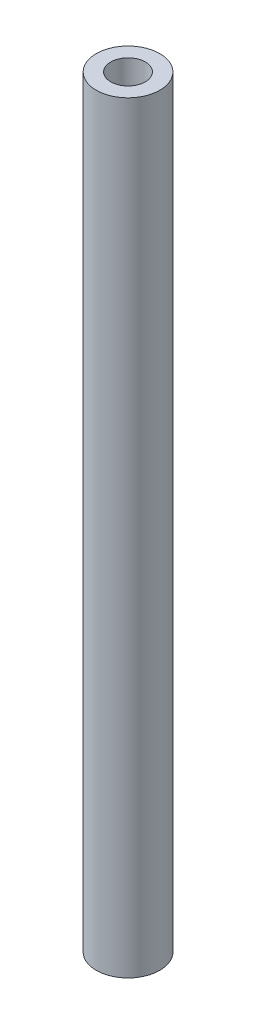
ISO-10303-21;
HEADER;
FILE_DESCRIPTION(('STEP AP214'),'2;1');
FILE_NAME('part.step','',(''),(''),'','','');
FILE_SCHEMA(('AUTOMOTIVE_DESIGN { 1 0 10303 214 1 1 1 1 }'));
ENDSEC;
DATA;
#1=APPLICATION_CONTEXT('core data for automotive mechanical design processes');
#2=APPLICATION_PROTOCOL_DEFINITION('international standard','automotive_design',2000,#1);
#3=PRODUCT_CONTEXT('',#1,'mechanical');
#4=PRODUCT('Part','Part','',(#3));
#5=PRODUCT_RELATED_PRODUCT_CATEGORY('part','',(#4));
#6=PRODUCT_DEFINITION_FORMATION('','',#4);
#7=PRODUCT_DEFINITION_CONTEXT('part definition',#1,'design');
#8=PRODUCT_DEFINITION('design','',#6,#7);
#9=PRODUCT_DEFINITION_SHAPE('','',#8);
#10=(LENGTH_UNIT() NAMED_UNIT(*) SI_UNIT(.MILLI.,.METRE.));
#11=(NAMED_UNIT(*) PLANE_ANGLE_UNIT() SI_UNIT($,.RADIAN.));
#12=(NAMED_UNIT(*) SI_UNIT($,.STERADIAN.) SOLID_ANGLE_UNIT());
#13=UNCERTAINTY_MEASURE_WITH_UNIT(LENGTH_MEASURE(1.E-05),#10,'distance_accuracy_value','');
#14=(GEOMETRIC_REPRESENTATION_CONTEXT(3) GLOBAL_UNCERTAINTY_ASSIGNED_CONTEXT((#13)) GLOBAL_UNIT_ASSIGNED_CONTEXT((#10,
#11,#12)) REPRESENTATION_CONTEXT('',''));
#15=CARTESIAN_POINT('',(0.,0.,0.));
#16=DIRECTION('',(0.,0.,1.));
#17=DIRECTION('',(1.,0.,0.));
#18=AXIS2_PLACEMENT_3D('',#15,#16,#17);
#19=CARTESIAN_POINT('',(0.,76.2,0.));
#20=DIRECTION('',(0.,-1.,0.));
#21=DIRECTION('',(0.,0.,-1.));
#22=AXIS2_PLACEMENT_3D('',#19,#20,#21);
#23=CYLINDRICAL_SURFACE('',#22,3.175);
#24=CARTESIAN_POINT('',(0.,76.2,0.));
#25=DIRECTION('',(0.,1.,0.));
#26=DIRECTION('',(0.,0.,1.));
#27=AXIS2_PLACEMENT_3D('',#24,#25,#26);
#28=CIRCLE('',#27,3.175);
#29=CARTESIAN_POINT('',(0.,76.2,-3.175));
#30=VERTEX_POINT('',#29);
#31=EDGE_CURVE('E11',#30,#30,#28,.T.);
#32=CARTESIAN_POINT('',(0.,0.,0.));
#33=DIRECTION('',(0.,1.,0.));
#34=DIRECTION('',(0.,0.,1.));
#35=AXIS2_PLACEMENT_3D('',#32,#33,#34);
#36=CIRCLE('',#35,3.175);
#37=CARTESIAN_POINT('',(0.,0.,-3.175));
#38=VERTEX_POINT('',#37);
#39=EDGE_CURVE('E39',#38,#38,#36,.T.);
#40=CARTESIAN_POINT('',(0.,76.2,-3.175));
#41=CARTESIAN_POINT('',(0.,75.40625,-3.175));
#42=CARTESIAN_POINT('',(0.,74.6125,-3.175));
#43=CARTESIAN_POINT('',(0.,73.025,-3.175));
#44=CARTESIAN_POINT('',(0.,72.23125,-3.175));
#45=CARTESIAN_POINT('',(0.,70.64375,-3.175));
#46=CARTESIAN_POINT('',(0.,69.85,-3.175));
#47=CARTESIAN_POINT('',(0.,68.2625,-3.175));
#48=CARTESIAN_POINT('',(0.,67.46875,-3.175));
#49=CARTESIAN_POINT('',(0.,65.88125,-3.175));
#50=CARTESIAN_POINT('',(0.,65.0875,-3.175));
#51=CARTESIAN_POINT('',(0.,63.5,-3.175));
#52=CARTESIAN_POINT('',(0.,62.70625,-3.175));
#53=CARTESIAN_POINT('',(0.,61.11875,-3.175));
#54=CARTESIAN_POINT('',(0.,60.325,-3.175));
#55=CARTESIAN_POINT('',(0.,58.7375,-3.175));
#56=CARTESIAN_POINT('',(0.,57.94375,-3.175));
#57=CARTESIAN_POINT('',(0.,56.35625,-3.175));
#58=CARTESIAN_POINT('',(0.,55.5625,-3.175));
#59=CARTESIAN_POINT('',(0.,53.975,-3.175));
#60=CARTESIAN_POINT('',(0.,53.18125,-3.175));
#61=CARTESIAN_POINT('',(0.,51.59375,-3.175));
#62=CARTESIAN_POINT('',(0.,50.8,-3.175));
#63=CARTESIAN_POINT('',(0.,49.2125,-3.175));
#64=CARTESIAN_POINT('',(0.,48.41875,-3.175));
#65=CARTESIAN_POINT('',(0.,46.83125,-3.175));
#66=CARTESIAN_POINT('',(0.,46.0375,-3.175));
#67=CARTESIAN_POINT('',(0.,44.45,-3.175));
#68=CARTESIAN_POINT('',(0.,43.65625,-3.175));
#69=CARTESIAN_POINT('',(0.,42.06875,-3.175));
#70=CARTESIAN_POINT('',(0.,41.275,-3.175));
#71=CARTESIAN_POINT('',(0.,39.6875,-3.175));
#72=CARTESIAN_POINT('',(0.,38.89375,-3.175));
#73=CARTESIAN_POINT('',(0.,37.30625,-3.175));
#74=CARTESIAN_POINT('',(0.,36.5125,-3.175));
#75=CARTESIAN_POINT('',(0.,34.925,-3.175));
#76=CARTESIAN_POINT('',(0.,34.13125,-3.175));
#77=CARTESIAN_POINT('',(0.,32.54375,-3.175));
#78=CARTESIAN_POINT('',(0.,31.75,-3.175));
#79=CARTESIAN_POINT('',(0.,30.1625,-3.175));
#80=CARTESIAN_POINT('',(0.,29.36875,-3.175));
#81=CARTESIAN_POINT('',(0.,27.78125,-3.175));
#82=CARTESIAN_POINT('',(0.,26.9875,-3.175));
#83=CARTESIAN_POINT('',(0.,25.4,-3.175));
#84=CARTESIAN_POINT('',(0.,24.60625,-3.175));
#85=CARTESIAN_POINT('',(0.,23.01875,-3.175));
#86=CARTESIAN_POINT('',(0.,22.225,-3.175));
#87=CARTESIAN_POINT('',(0.,20.6375,-3.175));
#88=CARTESIAN_POINT('',(0.,19.84375,-3.175));
#89=CARTESIAN_POINT('',(0.,18.25625,-3.175));
#90=CARTESIAN_POINT('',(0.,17.4625,-3.175));
#91=CARTESIAN_POINT('',(0.,15.875,-3.175));
#92=CARTESIAN_POINT('',(0.,15.08125,-3.175));
#93=CARTESIAN_POINT('',(0.,13.49375,-3.175));
#94=CARTESIAN_POINT('',(0.,12.7,-3.175));
#95=CARTESIAN_POINT('',(0.,11.1125,-3.175));
#96=CARTESIAN_POINT('',(0.,10.31875,-3.175));
#97=CARTESIAN_POINT('',(0.,8.73125,-3.175));
#98=CARTESIAN_POINT('',(0.,7.93750000000001,-3.175));
#99=CARTESIAN_POINT('',(0.,6.35,-3.175));
#100=CARTESIAN_POINT('',(0.,5.55625,-3.175));
#101=CARTESIAN_POINT('',(0.,3.96875,-3.175));
#102=CARTESIAN_POINT('',(0.,3.175,-3.175));
#103=CARTESIAN_POINT('',(0.,1.5875,-3.175));
#104=CARTESIAN_POINT('',(0.,0.793750000000001,-3.175));
#105=CARTESIAN_POINT('',(0.,0.,-3.175));
#106=B_SPLINE_CURVE_WITH_KNOTS('',3,(#40,#41,#42,#43,#44,#45,#46,#47,#48,#49,#50,#51,#52,#53,
#54,#55,#56,#57,#58,#59,#60,#61,#62,#63,#64,#65,#66,#67,#68,#69,#70,#71,#72,#73,#74,#75,#76,#77,
#78,#79,#80,#81,#82,#83,#84,#85,#86,#87,#88,#89,#90,#91,#92,#93,#94,#95,#96,#97,#98,#99,#100,
#101,#102,#103,#104,#105),.UNSPECIFIED.,.F.,.F.,(4,2,2,2,2,2,2,2,2,2,2,2,2,2,2,2,2,2,2,2,2,2,2,
2,2,2,2,2,2,2,2,2,4),(0.,2.38125,4.7625,7.14375,9.52500000000001,11.90625,14.2875,16.66875,
19.05,21.43125,23.8125,26.19375,28.575,30.95625,33.3375,35.71875,38.1,40.48125,42.8625,45.24375,
47.625,50.00625,52.3875,54.76875,57.15,59.53125,61.9125,64.29375,66.675,69.05625,71.4375,
73.81875,76.2),.UNSPECIFIED.);
#107=EDGE_CURVE('BSEAM36',#30,#38,#106,.T.);
#108=ORIENTED_EDGE('',*,*,#31,.F.);
#109=ORIENTED_EDGE('',*,*,#39,.T.);
#110=ORIENTED_EDGE('',*,*,#107,.T.);
#111=ORIENTED_EDGE('',*,*,#107,.F.);
#112=EDGE_LOOP('',(#108,#110,#109,#111));
#113=FACE_BOUND('',#112,.T.);
#114=ADVANCED_FACE('F36',(#113),#23,.T.);
#115=CARTESIAN_POINT('',(0.,76.2,0.));
#116=DIRECTION('',(0.,1.,0.));
#117=DIRECTION('',(0.,0.,1.));
#118=AXIS2_PLACEMENT_3D('',#115,#116,#117);
#119=PLANE('',#118);
#120=CARTESIAN_POINT('',(0.,76.2,0.));
#121=DIRECTION('',(0.,1.,0.));
#122=DIRECTION('',(0.,0.,1.));
#123=AXIS2_PLACEMENT_3D('',#120,#121,#122);
#124=CIRCLE('',#123,1.72719999999999);
#125=CARTESIAN_POINT('',(0.,76.2,1.72719999999999));
#126=VERTEX_POINT('',#125);
#127=EDGE_CURVE('E59',#126,#126,#124,.T.);
#128=ORIENTED_EDGE('',*,*,#127,.F.);
#129=EDGE_LOOP('',(#128));
#130=FACE_BOUND('',#129,.T.);
#131=ORIENTED_EDGE('',*,*,#31,.T.);
#132=EDGE_LOOP('',(#131));
#133=FACE_BOUND('',#132,.T.);
#134=ADVANCED_FACE('F78',(#130,#133),#119,.T.);
#135=CARTESIAN_POINT('',(0.,0.,0.));
#136=DIRECTION('',(0.,1.,0.));
#137=DIRECTION('',(0.,0.,1.));
#138=AXIS2_PLACEMENT_3D('',#135,#136,#137);
#139=PLANE('',#138);
#140=CARTESIAN_POINT('',(0.,0.,0.));
#141=DIRECTION('',(0.,-1.,0.));
#142=DIRECTION('',(0.,0.,-1.));
#143=AXIS2_PLACEMENT_3D('',#140,#141,#142);
#144=CIRCLE('',#143,1.72719999999999);
#145=CARTESIAN_POINT('',(0.,0.,-1.72719999999999));
#146=VERTEX_POINT('',#145);
#147=EDGE_CURVE('E60',#146,#146,#144,.T.);
#148=ORIENTED_EDGE('',*,*,#147,.F.);
#149=EDGE_LOOP('',(#148));
#150=FACE_BOUND('',#149,.T.);
#151=ORIENTED_EDGE('',*,*,#39,.F.);
#152=EDGE_LOOP('',(#151));
#153=FACE_BOUND('',#152,.T.);
#154=ADVANCED_FACE('F75',(#150,#153),#139,.F.);
#155=CARTESIAN_POINT('',(0.,66.2,0.));
#156=DIRECTION('',(0.,1.,0.));
#157=DIRECTION('',(0.,0.,1.));
#158=AXIS2_PLACEMENT_3D('',#155,#156,#157);
#159=CONICAL_SURFACE('',#158,1.7272,1.02974425867665);
#160=CARTESIAN_POINT('',(0.,65.1621935388156,0.));
#161=VERTEX_POINT('',#160);
#162=VERTEX_LOOP('',#161);
#163=FACE_BOUND('',#162,.T.);
#164=CARTESIAN_POINT('',(0.,66.2,0.));
#165=DIRECTION('',(0.,1.,0.));
#166=DIRECTION('',(0.,0.,1.));
#167=AXIS2_PLACEMENT_3D('',#164,#165,#166);
#168=CIRCLE('',#167,1.7272);
#169=CARTESIAN_POINT('',(0.,66.2,1.7272));
#170=VERTEX_POINT('',#169);
#171=EDGE_CURVE('E63',#170,#170,#168,.T.);
#172=ORIENTED_EDGE('',*,*,#171,.T.);
#173=EDGE_LOOP('',(#172));
#174=FACE_BOUND('',#173,.T.);
#175=ADVANCED_FACE('F77',(#163,#174),#159,.F.);
#176=CARTESIAN_POINT('',(0.,76.2,0.));
#177=DIRECTION('',(0.,1.,0.));
#178=DIRECTION('',(0.,0.,1.));
#179=AXIS2_PLACEMENT_3D('',#176,#177,#178);
#180=CYLINDRICAL_SURFACE('',#179,1.72719999999999);
#181=ORIENTED_EDGE('',*,*,#171,.F.);
#182=EDGE_LOOP('',(#181));
#183=FACE_BOUND('',#182,.T.);
#184=ORIENTED_EDGE('',*,*,#127,.T.);
#185=EDGE_LOOP('',(#184));
#186=FACE_BOUND('',#185,.T.);
#187=ADVANCED_FACE('F53',(#183,#186),#180,.F.);
#188=CARTESIAN_POINT('',(0.,9.99999999999999,0.));
#189=DIRECTION('',(0.,-1.,0.));
#190=DIRECTION('',(0.,0.,-1.));
#191=AXIS2_PLACEMENT_3D('',#188,#189,#190);
#192=CONICAL_SURFACE('',#191,1.72719999999999,1.02974425867665);
#193=CARTESIAN_POINT('',(0.,11.0378064611844,0.));
#194=VERTEX_POINT('',#193);
#195=VERTEX_LOOP('',#194);
#196=FACE_BOUND('',#195,.T.);
#197=CARTESIAN_POINT('',(0.,9.99999999999999,0.));
#198=DIRECTION('',(0.,-1.,0.));
#199=DIRECTION('',(0.,0.,-1.));
#200=AXIS2_PLACEMENT_3D('',#197,#198,#199);
#201=CIRCLE('',#200,1.72719999999999);
#202=CARTESIAN_POINT('',(0.,9.99999999999999,-1.72719999999999));
#203=VERTEX_POINT('',#202);
#204=EDGE_CURVE('E57',#203,#203,#201,.T.);
#205=ORIENTED_EDGE('',*,*,#204,.T.);
#206=EDGE_LOOP('',(#205));
#207=FACE_BOUND('',#206,.T.);
#208=ADVANCED_FACE('F49',(#196,#207),#192,.F.);
#209=CARTESIAN_POINT('',(0.,0.,0.));
#210=DIRECTION('',(0.,-1.,0.));
#211=DIRECTION('',(0.,0.,-1.));
#212=AXIS2_PLACEMENT_3D('',#209,#210,#211);
#213=CYLINDRICAL_SURFACE('',#212,1.72719999999999);
#214=ORIENTED_EDGE('',*,*,#204,.F.);
#215=EDGE_LOOP('',(#214));
#216=FACE_BOUND('',#215,.T.);
#217=ORIENTED_EDGE('',*,*,#147,.T.);
#218=EDGE_LOOP('',(#217));
#219=FACE_BOUND('',#218,.T.);
#220=ADVANCED_FACE('F52',(#216,#219),#213,.F.);
#221=CLOSED_SHELL('',(#114,#134,#154,#175,#187,#208,#220));
#222=MANIFOLD_SOLID_BREP('B2',#221);
#223=ADVANCED_BREP_SHAPE_REPRESENTATION('',(#18,#222),#14);
#224=SHAPE_DEFINITION_REPRESENTATION(#9,#223);
ENDSEC;
END-ISO-10303-21;
